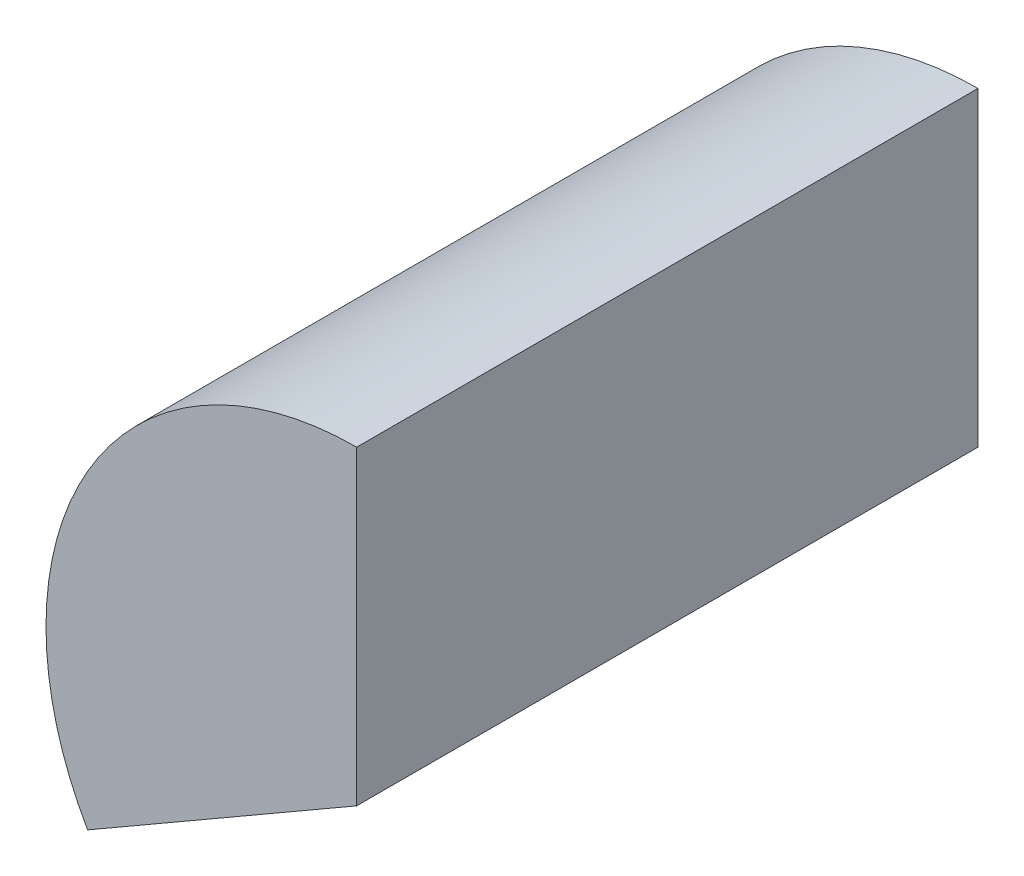
ISO-10303-21;
HEADER;
FILE_DESCRIPTION(('STEP AP214'),'2;1');
FILE_NAME('part.step','',(''),(''),'','','');
FILE_SCHEMA(('AUTOMOTIVE_DESIGN { 1 0 10303 214 1 1 1 1 }'));
ENDSEC;
DATA;
#1=APPLICATION_CONTEXT('core data for automotive mechanical design processes');
#2=APPLICATION_PROTOCOL_DEFINITION('international standard','automotive_design',2000,#1);
#3=PRODUCT_CONTEXT('',#1,'mechanical');
#4=PRODUCT('Part','Part','',(#3));
#5=PRODUCT_RELATED_PRODUCT_CATEGORY('part','',(#4));
#6=PRODUCT_DEFINITION_FORMATION('','',#4);
#7=PRODUCT_DEFINITION_CONTEXT('part definition',#1,'design');
#8=PRODUCT_DEFINITION('design','',#6,#7);
#9=PRODUCT_DEFINITION_SHAPE('','',#8);
#10=(LENGTH_UNIT() NAMED_UNIT(*) SI_UNIT(.MILLI.,.METRE.));
#11=(NAMED_UNIT(*) PLANE_ANGLE_UNIT() SI_UNIT($,.RADIAN.));
#12=(NAMED_UNIT(*) SI_UNIT($,.STERADIAN.) SOLID_ANGLE_UNIT());
#13=UNCERTAINTY_MEASURE_WITH_UNIT(LENGTH_MEASURE(1.E-05),#10,'distance_accuracy_value','');
#14=(GEOMETRIC_REPRESENTATION_CONTEXT(3) GLOBAL_UNCERTAINTY_ASSIGNED_CONTEXT((#13)) GLOBAL_UNIT_ASSIGNED_CONTEXT((#10,
#11,#12)) REPRESENTATION_CONTEXT('',''));
#15=CARTESIAN_POINT('',(0.,0.,0.));
#16=DIRECTION('',(0.,0.,1.));
#17=DIRECTION('',(1.,0.,0.));
#18=AXIS2_PLACEMENT_3D('',#15,#16,#17);
#19=CARTESIAN_POINT('',(0.,0.,50.));
#20=DIRECTION('',(-0.499999999999998,0.86602540378444,0.));
#21=DIRECTION('',(-0.86602540378444,-0.499999999999998,0.));
#22=AXIS2_PLACEMENT_3D('',#19,#20,#21);
#23=PLANE('',#22);
#24=DIRECTION('',(0.86602540378444,0.499999999999998,0.));
#25=VECTOR('',#24,1.);
#26=CARTESIAN_POINT('',(0.,0.,0.));
#27=LINE('',#26,#25);
#28=CARTESIAN_POINT('',(-21.650635094611,-12.4999999999999,0.));
#29=VERTEX_POINT('',#28);
#30=CARTESIAN_POINT('',(0.,0.,0.));
#31=VERTEX_POINT('',#30);
#32=EDGE_CURVE('E80',#29,#31,#27,.T.);
#33=ORIENTED_EDGE('',*,*,#32,.T.);
#34=DIRECTION('',(0.,0.,-1.));
#35=VECTOR('',#34,1.);
#36=CARTESIAN_POINT('',(0.,0.,50.));
#37=LINE('',#36,#35);
#38=CARTESIAN_POINT('',(0.,0.,50.));
#39=VERTEX_POINT('',#38);
#40=EDGE_CURVE('E11',#39,#31,#37,.T.);
#41=ORIENTED_EDGE('',*,*,#40,.F.);
#42=DIRECTION('',(0.86602540378444,0.499999999999998,0.));
#43=VECTOR('',#42,1.);
#44=CARTESIAN_POINT('',(0.,0.,50.));
#45=LINE('',#44,#43);
#46=CARTESIAN_POINT('',(-21.650635094611,-12.4999999999999,50.));
#47=VERTEX_POINT('',#46);
#48=EDGE_CURVE('E73',#47,#39,#45,.T.);
#49=ORIENTED_EDGE('',*,*,#48,.F.);
#50=DIRECTION('',(0.,0.,-1.));
#51=VECTOR('',#50,1.);
#52=CARTESIAN_POINT('',(-21.650635094611,-12.4999999999999,50.));
#53=LINE('',#52,#51);
#54=EDGE_CURVE('E81',#47,#29,#53,.T.);
#55=ORIENTED_EDGE('',*,*,#54,.T.);
#56=EDGE_LOOP('',(#33,#41,#49,#55));
#57=FACE_BOUND('',#56,.T.);
#58=ADVANCED_FACE('F33',(#57),#23,.F.);
#59=CARTESIAN_POINT('',(0.,25.,50.));
#60=DIRECTION('',(-1.,0.,0.));
#61=DIRECTION('',(0.,0.,1.));
#62=AXIS2_PLACEMENT_3D('',#59,#60,#61);
#63=PLANE('',#62);
#64=DIRECTION('',(0.,1.,0.));
#65=VECTOR('',#64,1.);
#66=CARTESIAN_POINT('',(0.,25.,0.));
#67=LINE('',#66,#65);
#68=CARTESIAN_POINT('',(0.,25.,0.));
#69=VERTEX_POINT('',#68);
#70=EDGE_CURVE('E61',#31,#69,#67,.T.);
#71=ORIENTED_EDGE('',*,*,#70,.T.);
#72=DIRECTION('',(0.,0.,-1.));
#73=VECTOR('',#72,1.);
#74=CARTESIAN_POINT('',(0.,25.,50.));
#75=LINE('',#74,#73);
#76=CARTESIAN_POINT('',(0.,25.,50.));
#77=VERTEX_POINT('',#76);
#78=EDGE_CURVE('E41',#77,#69,#75,.T.);
#79=ORIENTED_EDGE('',*,*,#78,.F.);
#80=DIRECTION('',(0.,1.,0.));
#81=VECTOR('',#80,1.);
#82=CARTESIAN_POINT('',(0.,25.,50.));
#83=LINE('',#82,#81);
#84=EDGE_CURVE('E69',#39,#77,#83,.T.);
#85=ORIENTED_EDGE('',*,*,#84,.F.);
#86=ORIENTED_EDGE('',*,*,#40,.T.);
#87=EDGE_LOOP('',(#71,#79,#85,#86));
#88=FACE_BOUND('',#87,.T.);
#89=ADVANCED_FACE('F70',(#88),#63,.F.);
#90=CARTESIAN_POINT('',(0.,0.,50.));
#91=DIRECTION('',(0.,0.,-1.));
#92=DIRECTION('',(-1.,0.,0.));
#93=AXIS2_PLACEMENT_3D('',#90,#91,#92);
#94=CYLINDRICAL_SURFACE('',#93,25.);
#95=CARTESIAN_POINT('',(0.,0.,0.));
#96=DIRECTION('',(0.,0.,1.));
#97=DIRECTION('',(1.,0.,0.));
#98=AXIS2_PLACEMENT_3D('',#95,#96,#97);
#99=CIRCLE('',#98,25.);
#100=EDGE_CURVE('E66',#69,#29,#99,.T.);
#101=ORIENTED_EDGE('',*,*,#100,.T.);
#102=ORIENTED_EDGE('',*,*,#54,.F.);
#103=CARTESIAN_POINT('',(0.,0.,50.));
#104=DIRECTION('',(0.,0.,1.));
#105=DIRECTION('',(1.,0.,0.));
#106=AXIS2_PLACEMENT_3D('',#103,#104,#105);
#107=CIRCLE('',#106,25.);
#108=EDGE_CURVE('E49',#77,#47,#107,.T.);
#109=ORIENTED_EDGE('',*,*,#108,.F.);
#110=ORIENTED_EDGE('',*,*,#78,.T.);
#111=EDGE_LOOP('',(#101,#102,#109,#110));
#112=FACE_BOUND('',#111,.T.);
#113=ADVANCED_FACE('F92',(#112),#94,.T.);
#114=CARTESIAN_POINT('',(0.,0.,50.));
#115=DIRECTION('',(0.,0.,1.));
#116=DIRECTION('',(1.,0.,0.));
#117=AXIS2_PLACEMENT_3D('',#114,#115,#116);
#118=PLANE('',#117);
#119=ORIENTED_EDGE('',*,*,#48,.T.);
#120=ORIENTED_EDGE('',*,*,#84,.T.);
#121=ORIENTED_EDGE('',*,*,#108,.T.);
#122=EDGE_LOOP('',(#119,#120,#121));
#123=FACE_BOUND('',#122,.T.);
#124=ADVANCED_FACE('F76',(#123),#118,.T.);
#125=CARTESIAN_POINT('',(0.,0.,0.));
#126=DIRECTION('',(0.,0.,1.));
#127=DIRECTION('',(1.,0.,0.));
#128=AXIS2_PLACEMENT_3D('',#125,#126,#127);
#129=PLANE('',#128);
#130=CARTESIAN_POINT('',(-11.4408354511818,7.24864086031444,0.));
#131=DIRECTION('',(0.,0.,-1.));
#132=DIRECTION('',(-1.,0.,0.));
#133=AXIS2_PLACEMENT_3D('',#130,#131,#132);
#134=CIRCLE('',#133,5.);
#135=CARTESIAN_POINT('',(-16.4408354511818,7.24864086031444,0.));
#136=VERTEX_POINT('',#135);
#137=EDGE_CURVE('E87',#136,#136,#134,.T.);
#138=ORIENTED_EDGE('',*,*,#137,.F.);
#139=EDGE_LOOP('',(#138));
#140=FACE_BOUND('',#139,.T.);
#141=ORIENTED_EDGE('',*,*,#32,.F.);
#142=ORIENTED_EDGE('',*,*,#100,.F.);
#143=ORIENTED_EDGE('',*,*,#70,.F.);
#144=EDGE_LOOP('',(#141,#142,#143));
#145=FACE_BOUND('',#144,.T.);
#146=ADVANCED_FACE('F93',(#140,#145),#129,.F.);
#147=CARTESIAN_POINT('',(-11.4408354511818,7.24864086031444,10.));
#148=DIRECTION('',(0.,0.,-1.));
#149=DIRECTION('',(-1.,0.,0.));
#150=AXIS2_PLACEMENT_3D('',#147,#148,#149);
#151=CYLINDRICAL_SURFACE('',#150,5.);
#152=CARTESIAN_POINT('',(-11.4408354511818,7.24864086031444,10.));
#153=DIRECTION('',(0.,0.,-1.));
#154=DIRECTION('',(-1.,0.,0.));
#155=AXIS2_PLACEMENT_3D('',#152,#153,#154);
#156=CIRCLE('',#155,5.);
#157=CARTESIAN_POINT('',(-16.4408354511818,7.24864086031444,10.));
#158=VERTEX_POINT('',#157);
#159=EDGE_CURVE('E83',#158,#158,#156,.T.);
#160=ORIENTED_EDGE('',*,*,#159,.F.);
#161=EDGE_LOOP('',(#160));
#162=FACE_BOUND('',#161,.T.);
#163=ORIENTED_EDGE('',*,*,#137,.T.);
#164=EDGE_LOOP('',(#163));
#165=FACE_BOUND('',#164,.T.);
#166=ADVANCED_FACE('F95',(#162,#165),#151,.F.);
#167=CARTESIAN_POINT('',(-11.4408354511818,7.24864086031444,10.));
#168=DIRECTION('',(0.,0.,-1.));
#169=DIRECTION('',(-1.,0.,0.));
#170=AXIS2_PLACEMENT_3D('',#167,#168,#169);
#171=PLANE('',#170);
#172=ORIENTED_EDGE('',*,*,#159,.T.);
#173=EDGE_LOOP('',(#172));
#174=FACE_BOUND('',#173,.T.);
#175=ADVANCED_FACE('F102',(#174),#171,.T.);
#176=CLOSED_SHELL('',(#58,#89,#113,#124,#146,#166,#175));
#177=MANIFOLD_SOLID_BREP('B2',#176);
#178=ADVANCED_BREP_SHAPE_REPRESENTATION('',(#18,#177),#14);
#179=SHAPE_DEFINITION_REPRESENTATION(#9,#178);
ENDSEC;
END-ISO-10303-21;
